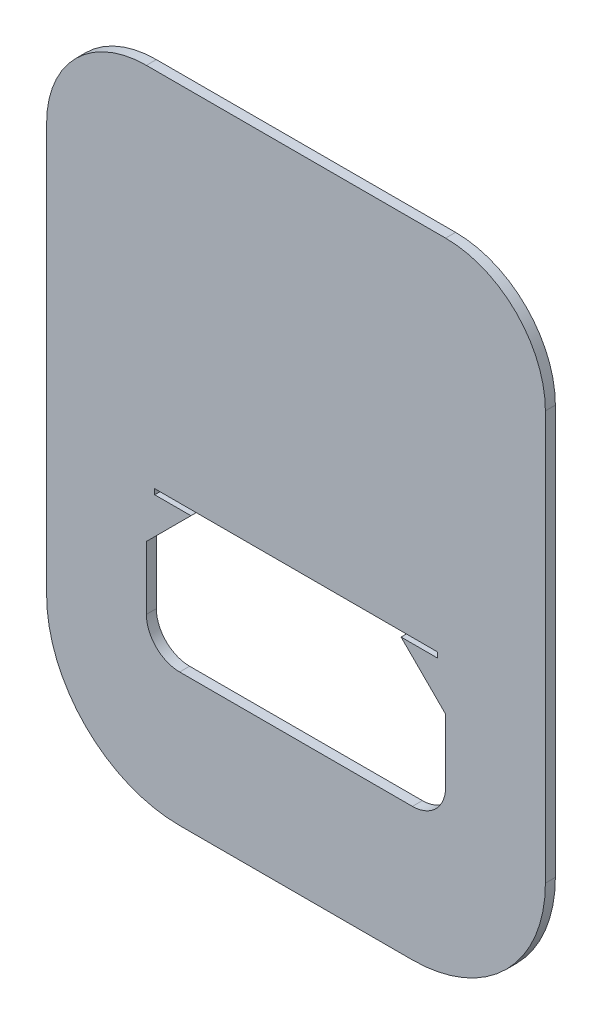
ISO-10303-21;
HEADER;
FILE_DESCRIPTION(('STEP AP214'),'2;1');
FILE_NAME('part.step','',(''),(''),'','','');
FILE_SCHEMA(('AUTOMOTIVE_DESIGN { 1 0 10303 214 1 1 1 1 }'));
ENDSEC;
DATA;
#1=APPLICATION_CONTEXT('core data for automotive mechanical design processes');
#2=APPLICATION_PROTOCOL_DEFINITION('international standard','automotive_design',2000,#1);
#3=PRODUCT_CONTEXT('',#1,'mechanical');
#4=PRODUCT('Part','Part','',(#3));
#5=PRODUCT_RELATED_PRODUCT_CATEGORY('part','',(#4));
#6=PRODUCT_DEFINITION_FORMATION('','',#4);
#7=PRODUCT_DEFINITION_CONTEXT('part definition',#1,'design');
#8=PRODUCT_DEFINITION('design','',#6,#7);
#9=PRODUCT_DEFINITION_SHAPE('','',#8);
#10=(LENGTH_UNIT() NAMED_UNIT(*) SI_UNIT(.MILLI.,.METRE.));
#11=(NAMED_UNIT(*) PLANE_ANGLE_UNIT() SI_UNIT($,.RADIAN.));
#12=(NAMED_UNIT(*) SI_UNIT($,.STERADIAN.) SOLID_ANGLE_UNIT());
#13=UNCERTAINTY_MEASURE_WITH_UNIT(LENGTH_MEASURE(1.E-05),#10,'distance_accuracy_value','');
#14=(GEOMETRIC_REPRESENTATION_CONTEXT(3) GLOBAL_UNCERTAINTY_ASSIGNED_CONTEXT((#13)) GLOBAL_UNIT_ASSIGNED_CONTEXT((#10,
#11,#12)) REPRESENTATION_CONTEXT('',''));
#15=CARTESIAN_POINT('',(0.,0.,0.));
#16=DIRECTION('',(0.,0.,1.));
#17=DIRECTION('',(1.,0.,0.));
#18=AXIS2_PLACEMENT_3D('',#15,#16,#17);
#19=CARTESIAN_POINT('',(-45.,66.5,3.));
#20=DIRECTION('',(0.,0.,-1.));
#21=DIRECTION('',(-1.,0.,0.));
#22=AXIS2_PLACEMENT_3D('',#19,#20,#21);
#23=CYLINDRICAL_SURFACE('',#22,30.);
#24=CARTESIAN_POINT('',(-45.,66.5,0.));
#25=DIRECTION('',(0.,0.,1.));
#26=DIRECTION('',(-1.,0.,0.));
#27=AXIS2_PLACEMENT_3D('',#24,#25,#26);
#28=CIRCLE('',#27,30.);
#29=CARTESIAN_POINT('',(-45.,96.5,0.));
#30=VERTEX_POINT('',#29);
#31=CARTESIAN_POINT('',(-75.,66.5,0.));
#32=VERTEX_POINT('',#31);
#33=EDGE_CURVE('E236',#30,#32,#28,.T.);
#34=ORIENTED_EDGE('',*,*,#33,.T.);
#35=DIRECTION('',(0.,0.,-1.));
#36=VECTOR('',#35,1.);
#37=CARTESIAN_POINT('',(-75.,66.5,3.));
#38=LINE('',#37,#36);
#39=CARTESIAN_POINT('',(-75.,66.5,3.));
#40=VERTEX_POINT('',#39);
#41=EDGE_CURVE('E191',#40,#32,#38,.T.);
#42=ORIENTED_EDGE('',*,*,#41,.F.);
#43=CARTESIAN_POINT('',(-45.,66.5,3.));
#44=DIRECTION('',(0.,0.,1.));
#45=DIRECTION('',(-1.,0.,0.));
#46=AXIS2_PLACEMENT_3D('',#43,#44,#45);
#47=CIRCLE('',#46,30.);
#48=CARTESIAN_POINT('',(-45.,96.5,3.));
#49=VERTEX_POINT('',#48);
#50=EDGE_CURVE('E237',#49,#40,#47,.T.);
#51=ORIENTED_EDGE('',*,*,#50,.F.);
#52=DIRECTION('',(0.,0.,-1.));
#53=VECTOR('',#52,1.);
#54=CARTESIAN_POINT('',(-45.,96.5,3.));
#55=LINE('',#54,#53);
#56=EDGE_CURVE('E255',#49,#30,#55,.T.);
#57=ORIENTED_EDGE('',*,*,#56,.T.);
#58=EDGE_LOOP('',(#34,#42,#51,#57));
#59=FACE_BOUND('',#58,.T.);
#60=ADVANCED_FACE('F39',(#59),#23,.T.);
#61=CARTESIAN_POINT('',(-75.,66.5,3.));
#62=DIRECTION('',(1.,0.,0.));
#63=DIRECTION('',(0.,1.,0.));
#64=AXIS2_PLACEMENT_3D('',#61,#62,#63);
#65=PLANE('',#64);
#66=DIRECTION('',(0.,-1.,0.));
#67=VECTOR('',#66,1.);
#68=CARTESIAN_POINT('',(-75.,66.5,0.));
#69=LINE('',#68,#67);
#70=CARTESIAN_POINT('',(-75.,-56.5,0.));
#71=VERTEX_POINT('',#70);
#72=EDGE_CURVE('E258',#32,#71,#69,.T.);
#73=ORIENTED_EDGE('',*,*,#72,.T.);
#74=DIRECTION('',(0.,0.,-1.));
#75=VECTOR('',#74,1.);
#76=CARTESIAN_POINT('',(-75.,-56.5,3.));
#77=LINE('',#76,#75);
#78=CARTESIAN_POINT('',(-75.,-56.5,3.));
#79=VERTEX_POINT('',#78);
#80=EDGE_CURVE('E289',#79,#71,#77,.T.);
#81=ORIENTED_EDGE('',*,*,#80,.F.);
#82=DIRECTION('',(0.,-1.,0.));
#83=VECTOR('',#82,1.);
#84=CARTESIAN_POINT('',(-75.,66.5,3.));
#85=LINE('',#84,#83);
#86=EDGE_CURVE('E240',#40,#79,#85,.T.);
#87=ORIENTED_EDGE('',*,*,#86,.F.);
#88=ORIENTED_EDGE('',*,*,#41,.T.);
#89=EDGE_LOOP('',(#73,#81,#87,#88));
#90=FACE_BOUND('',#89,.T.);
#91=ADVANCED_FACE('F353',(#90),#65,.F.);
#92=CARTESIAN_POINT('',(-35.,-56.5,3.));
#93=DIRECTION('',(0.,0.,-1.));
#94=DIRECTION('',(-1.,0.,0.));
#95=AXIS2_PLACEMENT_3D('',#92,#93,#94);
#96=CYLINDRICAL_SURFACE('',#95,40.);
#97=CARTESIAN_POINT('',(-35.,-56.5,0.));
#98=DIRECTION('',(0.,0.,1.));
#99=DIRECTION('',(1.,0.,0.));
#100=AXIS2_PLACEMENT_3D('',#97,#98,#99);
#101=CIRCLE('',#100,40.);
#102=CARTESIAN_POINT('',(-35.,-96.5,0.));
#103=VERTEX_POINT('',#102);
#104=EDGE_CURVE('E260',#71,#103,#101,.T.);
#105=ORIENTED_EDGE('',*,*,#104,.T.);
#106=DIRECTION('',(0.,0.,-1.));
#107=VECTOR('',#106,1.);
#108=CARTESIAN_POINT('',(-35.,-96.5,3.));
#109=LINE('',#108,#107);
#110=CARTESIAN_POINT('',(-35.,-96.5,3.));
#111=VERTEX_POINT('',#110);
#112=EDGE_CURVE('E286',#111,#103,#109,.T.);
#113=ORIENTED_EDGE('',*,*,#112,.F.);
#114=CARTESIAN_POINT('',(-35.,-56.5,3.));
#115=DIRECTION('',(0.,0.,1.));
#116=DIRECTION('',(1.,0.,0.));
#117=AXIS2_PLACEMENT_3D('',#114,#115,#116);
#118=CIRCLE('',#117,40.);
#119=EDGE_CURVE('E243',#79,#111,#118,.T.);
#120=ORIENTED_EDGE('',*,*,#119,.F.);
#121=ORIENTED_EDGE('',*,*,#80,.T.);
#122=EDGE_LOOP('',(#105,#113,#120,#121));
#123=FACE_BOUND('',#122,.T.);
#124=ADVANCED_FACE('F359',(#123),#96,.T.);
#125=CARTESIAN_POINT('',(0.500000000000024,-96.5,3.));
#126=DIRECTION('',(0.,1.,0.));
#127=DIRECTION('',(0.,0.,1.));
#128=AXIS2_PLACEMENT_3D('',#125,#126,#127);
#129=PLANE('',#128);
#130=DIRECTION('',(1.,0.,0.));
#131=VECTOR('',#130,1.);
#132=CARTESIAN_POINT('',(0.500000000000024,-96.5,0.));
#133=LINE('',#132,#131);
#134=CARTESIAN_POINT('',(35.,-96.5,0.));
#135=VERTEX_POINT('',#134);
#136=EDGE_CURVE('E263',#103,#135,#133,.T.);
#137=ORIENTED_EDGE('',*,*,#136,.T.);
#138=DIRECTION('',(0.,0.,-1.));
#139=VECTOR('',#138,1.);
#140=CARTESIAN_POINT('',(35.,-96.5,3.));
#141=LINE('',#140,#139);
#142=CARTESIAN_POINT('',(35.,-96.5,3.));
#143=VERTEX_POINT('',#142);
#144=EDGE_CURVE('E283',#143,#135,#141,.T.);
#145=ORIENTED_EDGE('',*,*,#144,.F.);
#146=DIRECTION('',(1.,0.,0.));
#147=VECTOR('',#146,1.);
#148=CARTESIAN_POINT('',(-35.,-96.5,3.));
#149=LINE('',#148,#147);
#150=EDGE_CURVE('E245',#111,#143,#149,.T.);
#151=ORIENTED_EDGE('',*,*,#150,.F.);
#152=ORIENTED_EDGE('',*,*,#112,.T.);
#153=EDGE_LOOP('',(#137,#145,#151,#152));
#154=FACE_BOUND('',#153,.T.);
#155=ADVANCED_FACE('F428',(#154),#129,.F.);
#156=CARTESIAN_POINT('',(35.,-56.5,3.));
#157=DIRECTION('',(0.,0.,-1.));
#158=DIRECTION('',(-1.,0.,0.));
#159=AXIS2_PLACEMENT_3D('',#156,#157,#158);
#160=CYLINDRICAL_SURFACE('',#159,40.);
#161=CARTESIAN_POINT('',(35.,-56.5,0.));
#162=DIRECTION('',(0.,0.,1.));
#163=DIRECTION('',(1.,0.,0.));
#164=AXIS2_PLACEMENT_3D('',#161,#162,#163);
#165=CIRCLE('',#164,40.);
#166=CARTESIAN_POINT('',(75.,-56.5,0.));
#167=VERTEX_POINT('',#166);
#168=EDGE_CURVE('E265',#135,#167,#165,.T.);
#169=ORIENTED_EDGE('',*,*,#168,.T.);
#170=DIRECTION('',(0.,0.,-1.));
#171=VECTOR('',#170,1.);
#172=CARTESIAN_POINT('',(75.,-56.5,3.));
#173=LINE('',#172,#171);
#174=CARTESIAN_POINT('',(75.,-56.5,3.));
#175=VERTEX_POINT('',#174);
#176=EDGE_CURVE('E280',#175,#167,#173,.T.);
#177=ORIENTED_EDGE('',*,*,#176,.F.);
#178=CARTESIAN_POINT('',(35.,-56.5,3.));
#179=DIRECTION('',(0.,0.,1.));
#180=DIRECTION('',(1.,0.,0.));
#181=AXIS2_PLACEMENT_3D('',#178,#179,#180);
#182=CIRCLE('',#181,40.);
#183=EDGE_CURVE('E247',#143,#175,#182,.T.);
#184=ORIENTED_EDGE('',*,*,#183,.F.);
#185=ORIENTED_EDGE('',*,*,#144,.T.);
#186=EDGE_LOOP('',(#169,#177,#184,#185));
#187=FACE_BOUND('',#186,.T.);
#188=ADVANCED_FACE('F424',(#187),#160,.T.);
#189=CARTESIAN_POINT('',(75.,66.5,3.));
#190=DIRECTION('',(-1.,0.,0.));
#191=DIRECTION('',(0.,-1.,0.));
#192=AXIS2_PLACEMENT_3D('',#189,#190,#191);
#193=PLANE('',#192);
#194=DIRECTION('',(0.,1.,0.));
#195=VECTOR('',#194,1.);
#196=CARTESIAN_POINT('',(75.,66.5,0.));
#197=LINE('',#196,#195);
#198=CARTESIAN_POINT('',(75.,66.5,0.));
#199=VERTEX_POINT('',#198);
#200=EDGE_CURVE('E267',#167,#199,#197,.T.);
#201=ORIENTED_EDGE('',*,*,#200,.T.);
#202=DIRECTION('',(0.,0.,-1.));
#203=VECTOR('',#202,1.);
#204=CARTESIAN_POINT('',(75.,66.5,3.));
#205=LINE('',#204,#203);
#206=CARTESIAN_POINT('',(75.,66.5,3.));
#207=VERTEX_POINT('',#206);
#208=EDGE_CURVE('E277',#207,#199,#205,.T.);
#209=ORIENTED_EDGE('',*,*,#208,.F.);
#210=DIRECTION('',(0.,1.,0.));
#211=VECTOR('',#210,1.);
#212=CARTESIAN_POINT('',(75.,66.5,3.));
#213=LINE('',#212,#211);
#214=EDGE_CURVE('E249',#175,#207,#213,.T.);
#215=ORIENTED_EDGE('',*,*,#214,.F.);
#216=ORIENTED_EDGE('',*,*,#176,.T.);
#217=EDGE_LOOP('',(#201,#209,#215,#216));
#218=FACE_BOUND('',#217,.T.);
#219=ADVANCED_FACE('F420',(#218),#193,.F.);
#220=CARTESIAN_POINT('',(45.,66.5,3.));
#221=DIRECTION('',(0.,0.,-1.));
#222=DIRECTION('',(-1.,0.,0.));
#223=AXIS2_PLACEMENT_3D('',#220,#221,#222);
#224=CYLINDRICAL_SURFACE('',#223,30.);
#225=CARTESIAN_POINT('',(45.,66.5,0.));
#226=DIRECTION('',(0.,0.,1.));
#227=DIRECTION('',(-1.,0.,0.));
#228=AXIS2_PLACEMENT_3D('',#225,#226,#227);
#229=CIRCLE('',#228,30.);
#230=CARTESIAN_POINT('',(45.,96.5,0.));
#231=VERTEX_POINT('',#230);
#232=EDGE_CURVE('E269',#199,#231,#229,.T.);
#233=ORIENTED_EDGE('',*,*,#232,.T.);
#234=DIRECTION('',(0.,0.,-1.));
#235=VECTOR('',#234,1.);
#236=CARTESIAN_POINT('',(45.,96.5,3.));
#237=LINE('',#236,#235);
#238=CARTESIAN_POINT('',(45.,96.5,3.));
#239=VERTEX_POINT('',#238);
#240=EDGE_CURVE('E274',#239,#231,#237,.T.);
#241=ORIENTED_EDGE('',*,*,#240,.F.);
#242=CARTESIAN_POINT('',(45.,66.5,3.));
#243=DIRECTION('',(0.,0.,1.));
#244=DIRECTION('',(-1.,0.,0.));
#245=AXIS2_PLACEMENT_3D('',#242,#243,#244);
#246=CIRCLE('',#245,30.);
#247=EDGE_CURVE('E251',#207,#239,#246,.T.);
#248=ORIENTED_EDGE('',*,*,#247,.F.);
#249=ORIENTED_EDGE('',*,*,#208,.T.);
#250=EDGE_LOOP('',(#233,#241,#248,#249));
#251=FACE_BOUND('',#250,.T.);
#252=ADVANCED_FACE('F416',(#251),#224,.T.);
#253=CARTESIAN_POINT('',(-45.,96.5,3.));
#254=DIRECTION('',(0.,-1.,0.));
#255=DIRECTION('',(1.,0.,0.));
#256=AXIS2_PLACEMENT_3D('',#253,#254,#255);
#257=PLANE('',#256);
#258=DIRECTION('',(-1.,0.,0.));
#259=VECTOR('',#258,1.);
#260=CARTESIAN_POINT('',(-45.,96.5,0.));
#261=LINE('',#260,#259);
#262=EDGE_CURVE('E241',#231,#30,#261,.T.);
#263=ORIENTED_EDGE('',*,*,#262,.T.);
#264=ORIENTED_EDGE('',*,*,#56,.F.);
#265=DIRECTION('',(-1.,0.,0.));
#266=VECTOR('',#265,1.);
#267=CARTESIAN_POINT('',(-45.,96.5,3.));
#268=LINE('',#267,#266);
#269=EDGE_CURVE('E253',#239,#49,#268,.T.);
#270=ORIENTED_EDGE('',*,*,#269,.F.);
#271=ORIENTED_EDGE('',*,*,#240,.T.);
#272=EDGE_LOOP('',(#263,#264,#270,#271));
#273=FACE_BOUND('',#272,.T.);
#274=ADVANCED_FACE('F411',(#273),#257,.F.);
#275=CARTESIAN_POINT('',(-45.,66.5,3.));
#276=DIRECTION('',(0.,0.,-1.));
#277=DIRECTION('',(-1.,0.,0.));
#278=AXIS2_PLACEMENT_3D('',#275,#276,#277);
#279=PLANE('',#278);
#280=DIRECTION('',(-0.707106781186544,-0.707106781186551,0.));
#281=VECTOR('',#280,1.);
#282=CARTESIAN_POINT('',(2.00000000000005,19.5000000000004,3.));
#283=LINE('',#282,#281);
#284=CARTESIAN_POINT('',(-45.,-27.5000000000001,3.));
#285=VERTEX_POINT('',#284);
#286=CARTESIAN_POINT('',(-31.6,-14.1,3.));
#287=VERTEX_POINT('',#286);
#288=EDGE_CURVE('E61',#285,#287,#283,.F.);
#289=ORIENTED_EDGE('',*,*,#288,.T.);
#290=DIRECTION('',(-1.,0.,0.));
#291=VECTOR('',#290,1.);
#292=CARTESIAN_POINT('',(-45.,-14.1,3.));
#293=LINE('',#292,#291);
#294=CARTESIAN_POINT('',(-42.5,-14.1,3.));
#295=VERTEX_POINT('',#294);
#296=EDGE_CURVE('E212',#287,#295,#293,.T.);
#297=ORIENTED_EDGE('',*,*,#296,.T.);
#298=DIRECTION('',(0.,1.,0.));
#299=VECTOR('',#298,1.);
#300=CARTESIAN_POINT('',(-42.5,66.5,3.));
#301=LINE('',#300,#299);
#302=CARTESIAN_POINT('',(-42.5,-12.5,3.));
#303=VERTEX_POINT('',#302);
#304=EDGE_CURVE('E225',#295,#303,#301,.T.);
#305=ORIENTED_EDGE('',*,*,#304,.T.);
#306=DIRECTION('',(-1.,0.,0.));
#307=VECTOR('',#306,1.);
#308=CARTESIAN_POINT('',(-45.,-12.5,3.));
#309=LINE('',#308,#307);
#310=CARTESIAN_POINT('',(42.5,-12.5,3.));
#311=VERTEX_POINT('',#310);
#312=EDGE_CURVE('E196',#311,#303,#309,.T.);
#313=ORIENTED_EDGE('',*,*,#312,.F.);
#314=DIRECTION('',(0.,-1.,0.));
#315=VECTOR('',#314,1.);
#316=CARTESIAN_POINT('',(42.5,66.5,3.));
#317=LINE('',#316,#315);
#318=CARTESIAN_POINT('',(42.5,-14.1,3.));
#319=VERTEX_POINT('',#318);
#320=EDGE_CURVE('E222',#311,#319,#317,.T.);
#321=ORIENTED_EDGE('',*,*,#320,.T.);
#322=CARTESIAN_POINT('',(31.5999999999999,-14.1,3.));
#323=VERTEX_POINT('',#322);
#324=EDGE_CURVE('E219',#319,#323,#293,.T.);
#325=ORIENTED_EDGE('',*,*,#324,.T.);
#326=DIRECTION('',(-0.707106781186552,0.707106781186543,0.));
#327=VECTOR('',#326,1.);
#328=CARTESIAN_POINT('',(-47.0000000000005,64.4999999999994,3.));
#329=LINE('',#328,#327);
#330=CARTESIAN_POINT('',(45.,-27.4999999999999,3.));
#331=VERTEX_POINT('',#330);
#332=EDGE_CURVE('E324',#323,#331,#329,.F.);
#333=ORIENTED_EDGE('',*,*,#332,.T.);
#334=DIRECTION('',(0.,1.,0.));
#335=VECTOR('',#334,1.);
#336=CARTESIAN_POINT('',(45.,-56.5,3.));
#337=LINE('',#336,#335);
#338=CARTESIAN_POINT('',(45.,-46.5,3.));
#339=VERTEX_POINT('',#338);
#340=EDGE_CURVE('E227',#339,#331,#337,.T.);
#341=ORIENTED_EDGE('',*,*,#340,.F.);
#342=CARTESIAN_POINT('',(35.,-46.5,3.));
#343=DIRECTION('',(0.,0.,-1.));
#344=DIRECTION('',(-1.,0.,0.));
#345=AXIS2_PLACEMENT_3D('',#342,#343,#344);
#346=CIRCLE('',#345,10.);
#347=CARTESIAN_POINT('',(35.,-56.5,3.));
#348=VERTEX_POINT('',#347);
#349=EDGE_CURVE('E310',#339,#348,#346,.T.);
#350=ORIENTED_EDGE('',*,*,#349,.T.);
#351=DIRECTION('',(1.,0.,0.));
#352=VECTOR('',#351,1.);
#353=CARTESIAN_POINT('',(-45.,-56.5,3.));
#354=LINE('',#353,#352);
#355=CARTESIAN_POINT('',(-35.,-56.5,3.));
#356=VERTEX_POINT('',#355);
#357=EDGE_CURVE('E233',#356,#348,#354,.T.);
#358=ORIENTED_EDGE('',*,*,#357,.F.);
#359=CARTESIAN_POINT('',(-35.,-46.5,3.));
#360=DIRECTION('',(0.,0.,-1.));
#361=DIRECTION('',(-1.,0.,0.));
#362=AXIS2_PLACEMENT_3D('',#359,#360,#361);
#363=CIRCLE('',#362,10.);
#364=CARTESIAN_POINT('',(-45.,-46.5,3.));
#365=VERTEX_POINT('',#364);
#366=EDGE_CURVE('E315',#356,#365,#363,.T.);
#367=ORIENTED_EDGE('',*,*,#366,.T.);
#368=DIRECTION('',(0.,-1.,0.));
#369=VECTOR('',#368,1.);
#370=CARTESIAN_POINT('',(-45.,-56.5,3.));
#371=LINE('',#370,#369);
#372=EDGE_CURVE('E231',#285,#365,#371,.T.);
#373=ORIENTED_EDGE('',*,*,#372,.F.);
#374=EDGE_LOOP('',(#289,#297,#305,#313,#321,#325,#333,#341,#350,#358,#367,#373));
#375=FACE_BOUND('',#374,.T.);
#376=ORIENTED_EDGE('',*,*,#50,.T.);
#377=ORIENTED_EDGE('',*,*,#86,.T.);
#378=ORIENTED_EDGE('',*,*,#119,.T.);
#379=ORIENTED_EDGE('',*,*,#150,.T.);
#380=ORIENTED_EDGE('',*,*,#183,.T.);
#381=ORIENTED_EDGE('',*,*,#214,.T.);
#382=ORIENTED_EDGE('',*,*,#247,.T.);
#383=ORIENTED_EDGE('',*,*,#269,.T.);
#384=EDGE_LOOP('',(#376,#377,#378,#379,#380,#381,#382,#383));
#385=FACE_BOUND('',#384,.T.);
#386=ADVANCED_FACE('F331',(#375,#385),#279,.F.);
#387=CARTESIAN_POINT('',(-45.,66.5,0.));
#388=DIRECTION('',(0.,0.,-1.));
#389=DIRECTION('',(-1.,0.,0.));
#390=AXIS2_PLACEMENT_3D('',#387,#388,#389);
#391=PLANE('',#390);
#392=DIRECTION('',(-1.,0.,0.));
#393=VECTOR('',#392,1.);
#394=CARTESIAN_POINT('',(42.5,-14.1,0.));
#395=LINE('',#394,#393);
#396=CARTESIAN_POINT('',(-31.6,-14.1,0.));
#397=VERTEX_POINT('',#396);
#398=CARTESIAN_POINT('',(-42.5,-14.1,0.));
#399=VERTEX_POINT('',#398);
#400=EDGE_CURVE('E207',#397,#399,#395,.T.);
#401=ORIENTED_EDGE('',*,*,#400,.F.);
#402=DIRECTION('',(0.707106781186544,0.707106781186551,0.));
#403=VECTOR('',#402,1.);
#404=CARTESIAN_POINT('',(-45.,-27.5000000000001,0.));
#405=LINE('',#404,#403);
#406=CARTESIAN_POINT('',(-45.,-27.5000000000001,0.));
#407=VERTEX_POINT('',#406);
#408=EDGE_CURVE('E48',#397,#407,#405,.F.);
#409=ORIENTED_EDGE('',*,*,#408,.T.);
#410=DIRECTION('',(0.,1.,0.));
#411=VECTOR('',#410,1.);
#412=CARTESIAN_POINT('',(-45.,66.5,0.));
#413=LINE('',#412,#411);
#414=CARTESIAN_POINT('',(-45.,-46.5,0.));
#415=VERTEX_POINT('',#414);
#416=EDGE_CURVE('E190',#415,#407,#413,.T.);
#417=ORIENTED_EDGE('',*,*,#416,.F.);
#418=CARTESIAN_POINT('',(-35.,-46.5,0.));
#419=DIRECTION('',(0.,0.,-1.));
#420=DIRECTION('',(-1.,0.,0.));
#421=AXIS2_PLACEMENT_3D('',#418,#419,#420);
#422=CIRCLE('',#421,10.);
#423=CARTESIAN_POINT('',(-35.,-56.5,0.));
#424=VERTEX_POINT('',#423);
#425=EDGE_CURVE('E318',#415,#424,#422,.F.);
#426=ORIENTED_EDGE('',*,*,#425,.T.);
#427=DIRECTION('',(-1.,0.,0.));
#428=VECTOR('',#427,1.);
#429=CARTESIAN_POINT('',(-45.,-56.5,0.));
#430=LINE('',#429,#428);
#431=CARTESIAN_POINT('',(35.,-56.5,0.));
#432=VERTEX_POINT('',#431);
#433=EDGE_CURVE('E295',#432,#424,#430,.T.);
#434=ORIENTED_EDGE('',*,*,#433,.F.);
#435=CARTESIAN_POINT('',(35.,-46.5,0.));
#436=DIRECTION('',(0.,0.,-1.));
#437=DIRECTION('',(-1.,0.,0.));
#438=AXIS2_PLACEMENT_3D('',#435,#436,#437);
#439=CIRCLE('',#438,10.);
#440=CARTESIAN_POINT('',(45.,-46.5,0.));
#441=VERTEX_POINT('',#440);
#442=EDGE_CURVE('E312',#432,#441,#439,.F.);
#443=ORIENTED_EDGE('',*,*,#442,.T.);
#444=DIRECTION('',(0.,-1.,0.));
#445=VECTOR('',#444,1.);
#446=CARTESIAN_POINT('',(45.,66.5,0.));
#447=LINE('',#446,#445);
#448=CARTESIAN_POINT('',(45.,-27.4999999999999,0.));
#449=VERTEX_POINT('',#448);
#450=EDGE_CURVE('E298',#449,#441,#447,.T.);
#451=ORIENTED_EDGE('',*,*,#450,.F.);
#452=DIRECTION('',(0.707106781186552,-0.707106781186543,0.));
#453=VECTOR('',#452,1.);
#454=CARTESIAN_POINT('',(29.9999999999999,-12.5,0.));
#455=LINE('',#454,#453);
#456=CARTESIAN_POINT('',(31.5999999999999,-14.1,0.));
#457=VERTEX_POINT('',#456);
#458=EDGE_CURVE('E326',#449,#457,#455,.F.);
#459=ORIENTED_EDGE('',*,*,#458,.T.);
#460=CARTESIAN_POINT('',(42.5,-14.1,0.));
#461=VERTEX_POINT('',#460);
#462=EDGE_CURVE('E200',#461,#457,#395,.T.);
#463=ORIENTED_EDGE('',*,*,#462,.F.);
#464=DIRECTION('',(0.,-1.,0.));
#465=VECTOR('',#464,1.);
#466=CARTESIAN_POINT('',(42.5,-14.1,0.));
#467=LINE('',#466,#465);
#468=CARTESIAN_POINT('',(42.5,-12.5,0.));
#469=VERTEX_POINT('',#468);
#470=EDGE_CURVE('E186',#469,#461,#467,.T.);
#471=ORIENTED_EDGE('',*,*,#470,.F.);
#472=DIRECTION('',(1.,0.,0.));
#473=VECTOR('',#472,1.);
#474=CARTESIAN_POINT('',(-45.,-12.5,0.));
#475=LINE('',#474,#473);
#476=CARTESIAN_POINT('',(-42.5,-12.5,0.));
#477=VERTEX_POINT('',#476);
#478=EDGE_CURVE('E178',#477,#469,#475,.T.);
#479=ORIENTED_EDGE('',*,*,#478,.F.);
#480=DIRECTION('',(0.,1.,0.));
#481=VECTOR('',#480,1.);
#482=CARTESIAN_POINT('',(-42.5,-14.1,0.));
#483=LINE('',#482,#481);
#484=EDGE_CURVE('E183',#399,#477,#483,.T.);
#485=ORIENTED_EDGE('',*,*,#484,.F.);
#486=EDGE_LOOP('',(#401,#409,#417,#426,#434,#443,#451,#459,#463,#471,#479,#485));
#487=FACE_BOUND('',#486,.T.);
#488=ORIENTED_EDGE('',*,*,#33,.F.);
#489=ORIENTED_EDGE('',*,*,#262,.F.);
#490=ORIENTED_EDGE('',*,*,#232,.F.);
#491=ORIENTED_EDGE('',*,*,#200,.F.);
#492=ORIENTED_EDGE('',*,*,#168,.F.);
#493=ORIENTED_EDGE('',*,*,#136,.F.);
#494=ORIENTED_EDGE('',*,*,#104,.F.);
#495=ORIENTED_EDGE('',*,*,#72,.F.);
#496=EDGE_LOOP('',(#488,#489,#490,#491,#492,#493,#494,#495));
#497=FACE_BOUND('',#496,.T.);
#498=ADVANCED_FACE('F180',(#487,#497),#391,.T.);
#499=CARTESIAN_POINT('',(45.,-56.5,-7.));
#500=DIRECTION('',(1.,0.,0.));
#501=DIRECTION('',(0.,0.,-1.));
#502=AXIS2_PLACEMENT_3D('',#499,#500,#501);
#503=PLANE('',#502);
#504=ORIENTED_EDGE('',*,*,#340,.T.);
#505=DIRECTION('',(0.,0.,-1.));
#506=VECTOR('',#505,1.);
#507=CARTESIAN_POINT('',(45.,-27.4999999999999,0.));
#508=LINE('',#507,#506);
#509=EDGE_CURVE('E320',#331,#449,#508,.T.);
#510=ORIENTED_EDGE('',*,*,#509,.T.);
#511=ORIENTED_EDGE('',*,*,#450,.T.);
#512=DIRECTION('',(0.,0.,1.));
#513=VECTOR('',#512,1.);
#514=CARTESIAN_POINT('',(45.,-46.5,3.));
#515=LINE('',#514,#513);
#516=EDGE_CURVE('E300',#441,#339,#515,.T.);
#517=ORIENTED_EDGE('',*,*,#516,.T.);
#518=EDGE_LOOP('',(#504,#510,#511,#517));
#519=FACE_BOUND('',#518,.T.);
#520=ADVANCED_FACE('F384',(#519),#503,.F.);
#521=CARTESIAN_POINT('',(-45.,-56.5,-7.));
#522=DIRECTION('',(0.,-1.,0.));
#523=DIRECTION('',(0.,0.,-1.));
#524=AXIS2_PLACEMENT_3D('',#521,#522,#523);
#525=PLANE('',#524);
#526=ORIENTED_EDGE('',*,*,#357,.T.);
#527=DIRECTION('',(0.,0.,1.));
#528=VECTOR('',#527,1.);
#529=CARTESIAN_POINT('',(35.,-56.5,0.));
#530=LINE('',#529,#528);
#531=EDGE_CURVE('E306',#348,#432,#530,.F.);
#532=ORIENTED_EDGE('',*,*,#531,.T.);
#533=ORIENTED_EDGE('',*,*,#433,.T.);
#534=DIRECTION('',(0.,0.,1.));
#535=VECTOR('',#534,1.);
#536=CARTESIAN_POINT('',(-35.,-56.5,3.));
#537=LINE('',#536,#535);
#538=EDGE_CURVE('E303',#424,#356,#537,.T.);
#539=ORIENTED_EDGE('',*,*,#538,.T.);
#540=EDGE_LOOP('',(#526,#532,#533,#539));
#541=FACE_BOUND('',#540,.T.);
#542=ADVANCED_FACE('F390',(#541),#525,.F.);
#543=CARTESIAN_POINT('',(-45.,-56.5,-7.));
#544=DIRECTION('',(-1.,0.,0.));
#545=DIRECTION('',(0.,0.,1.));
#546=AXIS2_PLACEMENT_3D('',#543,#544,#545);
#547=PLANE('',#546);
#548=ORIENTED_EDGE('',*,*,#416,.T.);
#549=DIRECTION('',(0.,0.,1.));
#550=VECTOR('',#549,1.);
#551=CARTESIAN_POINT('',(-45.,-27.5000000000001,3.));
#552=LINE('',#551,#550);
#553=EDGE_CURVE('E322',#407,#285,#552,.T.);
#554=ORIENTED_EDGE('',*,*,#553,.T.);
#555=ORIENTED_EDGE('',*,*,#372,.T.);
#556=DIRECTION('',(0.,0.,1.));
#557=VECTOR('',#556,1.);
#558=CARTESIAN_POINT('',(-45.,-46.5,0.));
#559=LINE('',#558,#557);
#560=EDGE_CURVE('E308',#365,#415,#559,.F.);
#561=ORIENTED_EDGE('',*,*,#560,.T.);
#562=EDGE_LOOP('',(#548,#554,#555,#561));
#563=FACE_BOUND('',#562,.T.);
#564=ADVANCED_FACE('F336',(#563),#547,.F.);
#565=CARTESIAN_POINT('',(-45.,-12.5,-7.));
#566=DIRECTION('',(0.,1.,0.));
#567=DIRECTION('',(0.,0.,1.));
#568=AXIS2_PLACEMENT_3D('',#565,#566,#567);
#569=PLANE('',#568);
#570=ORIENTED_EDGE('',*,*,#478,.T.);
#571=DIRECTION('',(0.,0.,-1.));
#572=VECTOR('',#571,1.);
#573=CARTESIAN_POINT('',(42.5,-12.5,10.));
#574=LINE('',#573,#572);
#575=EDGE_CURVE('E199',#311,#469,#574,.T.);
#576=ORIENTED_EDGE('',*,*,#575,.F.);
#577=ORIENTED_EDGE('',*,*,#312,.T.);
#578=DIRECTION('',(0.,0.,-1.));
#579=VECTOR('',#578,1.);
#580=CARTESIAN_POINT('',(-42.5,-12.5,10.));
#581=LINE('',#580,#579);
#582=EDGE_CURVE('E194',#303,#477,#581,.T.);
#583=ORIENTED_EDGE('',*,*,#582,.T.);
#584=EDGE_LOOP('',(#570,#576,#577,#583));
#585=FACE_BOUND('',#584,.T.);
#586=ADVANCED_FACE('F195',(#585),#569,.F.);
#587=CARTESIAN_POINT('',(35.,-46.5,-7.));
#588=DIRECTION('',(0.,0.,-1.));
#589=DIRECTION('',(-1.,0.,0.));
#590=AXIS2_PLACEMENT_3D('',#587,#588,#589);
#591=CYLINDRICAL_SURFACE('',#590,10.);
#592=ORIENTED_EDGE('',*,*,#442,.F.);
#593=ORIENTED_EDGE('',*,*,#531,.F.);
#594=ORIENTED_EDGE('',*,*,#349,.F.);
#595=ORIENTED_EDGE('',*,*,#516,.F.);
#596=EDGE_LOOP('',(#592,#593,#594,#595));
#597=FACE_BOUND('',#596,.T.);
#598=ADVANCED_FACE('F364',(#597),#591,.F.);
#599=CARTESIAN_POINT('',(-35.,-46.5,-7.));
#600=DIRECTION('',(0.,0.,-1.));
#601=DIRECTION('',(-1.,0.,0.));
#602=AXIS2_PLACEMENT_3D('',#599,#600,#601);
#603=CYLINDRICAL_SURFACE('',#602,10.);
#604=ORIENTED_EDGE('',*,*,#425,.F.);
#605=ORIENTED_EDGE('',*,*,#560,.F.);
#606=ORIENTED_EDGE('',*,*,#366,.F.);
#607=ORIENTED_EDGE('',*,*,#538,.F.);
#608=EDGE_LOOP('',(#604,#605,#606,#607));
#609=FACE_BOUND('',#608,.T.);
#610=ADVANCED_FACE('F367',(#609),#603,.F.);
#611=CARTESIAN_POINT('',(29.9999999999999,-12.5,-7.));
#612=DIRECTION('',(-0.707106781186543,-0.707106781186552,0.));
#613=DIRECTION('',(0.,0.,-1.));
#614=AXIS2_PLACEMENT_3D('',#611,#612,#613);
#615=PLANE('',#614);
#616=ORIENTED_EDGE('',*,*,#332,.F.);
#617=DIRECTION('',(0.,0.,1.));
#618=VECTOR('',#617,1.);
#619=CARTESIAN_POINT('',(31.5999999999999,-14.1,-7.));
#620=LINE('',#619,#618);
#621=EDGE_CURVE('E218',#323,#457,#620,.F.);
#622=ORIENTED_EDGE('',*,*,#621,.T.);
#623=ORIENTED_EDGE('',*,*,#458,.F.);
#624=ORIENTED_EDGE('',*,*,#509,.F.);
#625=EDGE_LOOP('',(#616,#622,#623,#624));
#626=FACE_BOUND('',#625,.T.);
#627=ADVANCED_FACE('F348',(#626),#615,.T.);
#628=CARTESIAN_POINT('',(-45.,-27.5000000000001,-7.));
#629=DIRECTION('',(0.707106781186551,-0.707106781186544,0.));
#630=DIRECTION('',(0.,0.,-1.));
#631=AXIS2_PLACEMENT_3D('',#628,#629,#630);
#632=PLANE('',#631);
#633=ORIENTED_EDGE('',*,*,#408,.F.);
#634=DIRECTION('',(0.,0.,-1.));
#635=VECTOR('',#634,1.);
#636=CARTESIAN_POINT('',(-31.6,-14.1,-7.));
#637=LINE('',#636,#635);
#638=EDGE_CURVE('E11',#397,#287,#637,.F.);
#639=ORIENTED_EDGE('',*,*,#638,.T.);
#640=ORIENTED_EDGE('',*,*,#288,.F.);
#641=ORIENTED_EDGE('',*,*,#553,.F.);
#642=EDGE_LOOP('',(#633,#639,#640,#641));
#643=FACE_BOUND('',#642,.T.);
#644=ADVANCED_FACE('F42',(#643),#632,.T.);
#645=CARTESIAN_POINT('',(42.5,-14.1,10.));
#646=DIRECTION('',(0.,-1.,0.));
#647=DIRECTION('',(0.,0.,-1.));
#648=AXIS2_PLACEMENT_3D('',#645,#646,#647);
#649=PLANE('',#648);
#650=ORIENTED_EDGE('',*,*,#638,.F.);
#651=ORIENTED_EDGE('',*,*,#400,.T.);
#652=DIRECTION('',(0.,0.,-1.));
#653=VECTOR('',#652,1.);
#654=CARTESIAN_POINT('',(-42.5,-14.1,10.));
#655=LINE('',#654,#653);
#656=EDGE_CURVE('E204',#295,#399,#655,.T.);
#657=ORIENTED_EDGE('',*,*,#656,.F.);
#658=ORIENTED_EDGE('',*,*,#296,.F.);
#659=EDGE_LOOP('',(#650,#651,#657,#658));
#660=FACE_BOUND('',#659,.T.);
#661=ADVANCED_FACE('F338',(#660),#649,.F.);
#662=CARTESIAN_POINT('',(-42.5,-14.1,10.));
#663=DIRECTION('',(-1.,0.,0.));
#664=DIRECTION('',(0.,0.,1.));
#665=AXIS2_PLACEMENT_3D('',#662,#663,#664);
#666=PLANE('',#665);
#667=ORIENTED_EDGE('',*,*,#656,.T.);
#668=ORIENTED_EDGE('',*,*,#484,.T.);
#669=ORIENTED_EDGE('',*,*,#582,.F.);
#670=ORIENTED_EDGE('',*,*,#304,.F.);
#671=EDGE_LOOP('',(#667,#668,#669,#670));
#672=FACE_BOUND('',#671,.T.);
#673=ADVANCED_FACE('F202',(#672),#666,.F.);
#674=CARTESIAN_POINT('',(42.5,-14.1,10.));
#675=DIRECTION('',(1.,0.,0.));
#676=DIRECTION('',(0.,0.,-1.));
#677=AXIS2_PLACEMENT_3D('',#674,#675,#676);
#678=PLANE('',#677);
#679=ORIENTED_EDGE('',*,*,#575,.T.);
#680=ORIENTED_EDGE('',*,*,#470,.T.);
#681=DIRECTION('',(0.,0.,-1.));
#682=VECTOR('',#681,1.);
#683=CARTESIAN_POINT('',(42.5,-14.1,10.));
#684=LINE('',#683,#682);
#685=EDGE_CURVE('E213',#319,#461,#684,.T.);
#686=ORIENTED_EDGE('',*,*,#685,.F.);
#687=ORIENTED_EDGE('',*,*,#320,.F.);
#688=EDGE_LOOP('',(#679,#680,#686,#687));
#689=FACE_BOUND('',#688,.T.);
#690=ADVANCED_FACE('F346',(#689),#678,.F.);
#691=ORIENTED_EDGE('',*,*,#685,.T.);
#692=ORIENTED_EDGE('',*,*,#462,.T.);
#693=ORIENTED_EDGE('',*,*,#621,.F.);
#694=ORIENTED_EDGE('',*,*,#324,.F.);
#695=EDGE_LOOP('',(#691,#692,#693,#694));
#696=FACE_BOUND('',#695,.T.);
#697=ADVANCED_FACE('F341',(#696),#649,.F.);
#698=CLOSED_SHELL('',(#60,#91,#124,#155,#188,#219,#252,#274,#386,#498,#520,#542,#564,#586,#598,
#610,#627,#644,#661,#673,#690,#697));
#699=MANIFOLD_SOLID_BREP('B2',#698);
#700=ADVANCED_BREP_SHAPE_REPRESENTATION('',(#18,#699),#14);
#701=SHAPE_DEFINITION_REPRESENTATION(#9,#700);
ENDSEC;
END-ISO-10303-21;
